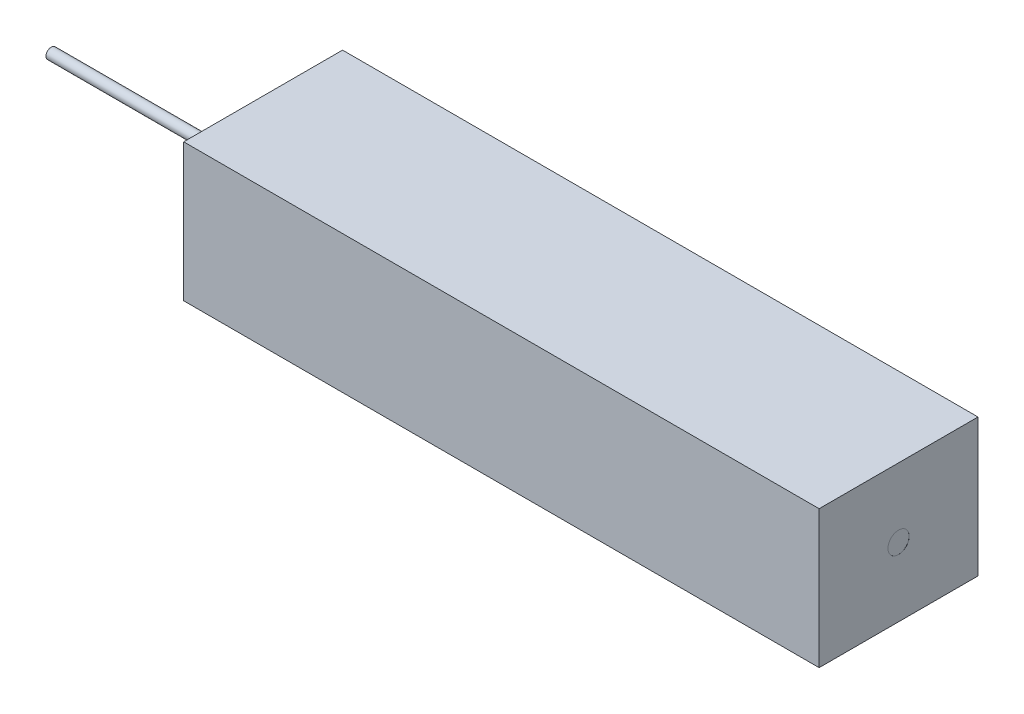
ISO-10303-21;
HEADER;
FILE_DESCRIPTION(('STEP AP214'),'2;1');
FILE_NAME('part.step','',(''),(''),'','','');
FILE_SCHEMA(('AUTOMOTIVE_DESIGN { 1 0 10303 214 1 1 1 1 }'));
ENDSEC;
DATA;
#1=APPLICATION_CONTEXT('core data for automotive mechanical design processes');
#2=APPLICATION_PROTOCOL_DEFINITION('international standard','automotive_design',2000,#1);
#3=PRODUCT_CONTEXT('',#1,'mechanical');
#4=PRODUCT('Part','Part','',(#3));
#5=PRODUCT_RELATED_PRODUCT_CATEGORY('part','',(#4));
#6=PRODUCT_DEFINITION_FORMATION('','',#4);
#7=PRODUCT_DEFINITION_CONTEXT('part definition',#1,'design');
#8=PRODUCT_DEFINITION('design','',#6,#7);
#9=PRODUCT_DEFINITION_SHAPE('','',#8);
#10=(LENGTH_UNIT() NAMED_UNIT(*) SI_UNIT(.MILLI.,.METRE.));
#11=(NAMED_UNIT(*) PLANE_ANGLE_UNIT() SI_UNIT($,.RADIAN.));
#12=(NAMED_UNIT(*) SI_UNIT($,.STERADIAN.) SOLID_ANGLE_UNIT());
#13=UNCERTAINTY_MEASURE_WITH_UNIT(LENGTH_MEASURE(1.E-05),#10,'distance_accuracy_value','');
#14=(GEOMETRIC_REPRESENTATION_CONTEXT(3) GLOBAL_UNCERTAINTY_ASSIGNED_CONTEXT((#13)) GLOBAL_UNIT_ASSIGNED_CONTEXT((#10,
#11,#12)) REPRESENTATION_CONTEXT('',''));
#15=CARTESIAN_POINT('',(0.,0.,0.));
#16=DIRECTION('',(0.,0.,1.));
#17=DIRECTION('',(1.,0.,0.));
#18=AXIS2_PLACEMENT_3D('',#15,#16,#17);
#19=CARTESIAN_POINT('',(600.,65.,-75.));
#20=DIRECTION('',(0.,0.,1.));
#21=DIRECTION('',(0.,-1.,0.));
#22=AXIS2_PLACEMENT_3D('',#19,#20,#21);
#23=PLANE('',#22);
#24=DIRECTION('',(0.,1.,0.));
#25=VECTOR('',#24,1.);
#26=CARTESIAN_POINT('',(0.,65.,-75.));
#27=LINE('',#26,#25);
#28=CARTESIAN_POINT('',(0.,-65.,-75.));
#29=VERTEX_POINT('',#28);
#30=CARTESIAN_POINT('',(0.,65.,-75.));
#31=VERTEX_POINT('',#30);
#32=EDGE_CURVE('E105',#29,#31,#27,.T.);
#33=ORIENTED_EDGE('',*,*,#32,.T.);
#34=DIRECTION('',(-1.,0.,0.));
#35=VECTOR('',#34,1.);
#36=CARTESIAN_POINT('',(600.,65.,-75.));
#37=LINE('',#36,#35);
#38=CARTESIAN_POINT('',(600.,65.,-75.));
#39=VERTEX_POINT('',#38);
#40=EDGE_CURVE('E47',#39,#31,#37,.T.);
#41=ORIENTED_EDGE('',*,*,#40,.F.);
#42=DIRECTION('',(0.,1.,0.));
#43=VECTOR('',#42,1.);
#44=CARTESIAN_POINT('',(600.,65.,-75.));
#45=LINE('',#44,#43);
#46=CARTESIAN_POINT('',(600.,-65.,-75.));
#47=VERTEX_POINT('',#46);
#48=EDGE_CURVE('E91',#47,#39,#45,.T.);
#49=ORIENTED_EDGE('',*,*,#48,.F.);
#50=DIRECTION('',(-1.,0.,0.));
#51=VECTOR('',#50,1.);
#52=CARTESIAN_POINT('',(600.,-65.,-75.));
#53=LINE('',#52,#51);
#54=EDGE_CURVE('E101',#47,#29,#53,.T.);
#55=ORIENTED_EDGE('',*,*,#54,.T.);
#56=EDGE_LOOP('',(#33,#41,#49,#55));
#57=FACE_BOUND('',#56,.T.);
#58=ADVANCED_FACE('F39',(#57),#23,.F.);
#59=CARTESIAN_POINT('',(600.,65.,75.));
#60=DIRECTION('',(0.,-1.,0.));
#61=DIRECTION('',(0.,0.,-1.));
#62=AXIS2_PLACEMENT_3D('',#59,#60,#61);
#63=PLANE('',#62);
#64=DIRECTION('',(0.,0.,1.));
#65=VECTOR('',#64,1.);
#66=CARTESIAN_POINT('',(0.,65.,75.));
#67=LINE('',#66,#65);
#68=CARTESIAN_POINT('',(0.,65.,75.));
#69=VERTEX_POINT('',#68);
#70=EDGE_CURVE('E96',#31,#69,#67,.T.);
#71=ORIENTED_EDGE('',*,*,#70,.T.);
#72=DIRECTION('',(-1.,0.,0.));
#73=VECTOR('',#72,1.);
#74=CARTESIAN_POINT('',(600.,65.,75.));
#75=LINE('',#74,#73);
#76=CARTESIAN_POINT('',(600.,65.,75.));
#77=VERTEX_POINT('',#76);
#78=EDGE_CURVE('E94',#77,#69,#75,.T.);
#79=ORIENTED_EDGE('',*,*,#78,.F.);
#80=DIRECTION('',(0.,0.,1.));
#81=VECTOR('',#80,1.);
#82=CARTESIAN_POINT('',(600.,65.,75.));
#83=LINE('',#82,#81);
#84=EDGE_CURVE('E86',#39,#77,#83,.T.);
#85=ORIENTED_EDGE('',*,*,#84,.F.);
#86=ORIENTED_EDGE('',*,*,#40,.T.);
#87=EDGE_LOOP('',(#71,#79,#85,#86));
#88=FACE_BOUND('',#87,.T.);
#89=ADVANCED_FACE('F95',(#88),#63,.F.);
#90=CARTESIAN_POINT('',(600.,65.,75.));
#91=DIRECTION('',(0.,0.,-1.));
#92=DIRECTION('',(0.,1.,0.));
#93=AXIS2_PLACEMENT_3D('',#90,#91,#92);
#94=PLANE('',#93);
#95=DIRECTION('',(0.,-1.,0.));
#96=VECTOR('',#95,1.);
#97=CARTESIAN_POINT('',(0.,65.,75.));
#98=LINE('',#97,#96);
#99=CARTESIAN_POINT('',(0.,-65.,75.));
#100=VERTEX_POINT('',#99);
#101=EDGE_CURVE('E72',#69,#100,#98,.T.);
#102=ORIENTED_EDGE('',*,*,#101,.T.);
#103=DIRECTION('',(-1.,0.,0.));
#104=VECTOR('',#103,1.);
#105=CARTESIAN_POINT('',(600.,-65.,75.));
#106=LINE('',#105,#104);
#107=CARTESIAN_POINT('',(600.,-65.,75.));
#108=VERTEX_POINT('',#107);
#109=EDGE_CURVE('E97',#108,#100,#106,.T.);
#110=ORIENTED_EDGE('',*,*,#109,.F.);
#111=DIRECTION('',(0.,-1.,0.));
#112=VECTOR('',#111,1.);
#113=CARTESIAN_POINT('',(600.,65.,75.));
#114=LINE('',#113,#112);
#115=EDGE_CURVE('E89',#77,#108,#114,.T.);
#116=ORIENTED_EDGE('',*,*,#115,.F.);
#117=ORIENTED_EDGE('',*,*,#78,.T.);
#118=EDGE_LOOP('',(#102,#110,#116,#117));
#119=FACE_BOUND('',#118,.T.);
#120=ADVANCED_FACE('F99',(#119),#94,.F.);
#121=CARTESIAN_POINT('',(600.,-65.,75.));
#122=DIRECTION('',(0.,1.,0.));
#123=DIRECTION('',(0.,0.,1.));
#124=AXIS2_PLACEMENT_3D('',#121,#122,#123);
#125=PLANE('',#124);
#126=DIRECTION('',(0.,0.,-1.));
#127=VECTOR('',#126,1.);
#128=CARTESIAN_POINT('',(0.,-65.,75.));
#129=LINE('',#128,#127);
#130=EDGE_CURVE('E78',#100,#29,#129,.T.);
#131=ORIENTED_EDGE('',*,*,#130,.T.);
#132=ORIENTED_EDGE('',*,*,#54,.F.);
#133=DIRECTION('',(0.,0.,-1.));
#134=VECTOR('',#133,1.);
#135=CARTESIAN_POINT('',(600.,-65.,75.));
#136=LINE('',#135,#134);
#137=EDGE_CURVE('E55',#108,#47,#136,.T.);
#138=ORIENTED_EDGE('',*,*,#137,.F.);
#139=ORIENTED_EDGE('',*,*,#109,.T.);
#140=EDGE_LOOP('',(#131,#132,#138,#139));
#141=FACE_BOUND('',#140,.T.);
#142=ADVANCED_FACE('F129',(#141),#125,.F.);
#143=CARTESIAN_POINT('',(600.,0.,0.));
#144=DIRECTION('',(1.,0.,0.));
#145=DIRECTION('',(0.,0.,-1.));
#146=AXIS2_PLACEMENT_3D('',#143,#144,#145);
#147=PLANE('',#146);
#148=CARTESIAN_POINT('',(600.,0.,0.));
#149=DIRECTION('',(1.,0.,0.));
#150=DIRECTION('',(0.,0.,-1.));
#151=AXIS2_PLACEMENT_3D('',#148,#149,#150);
#152=CIRCLE('',#151,10.);
#153=CARTESIAN_POINT('',(600.,0.,-10.));
#154=VERTEX_POINT('',#153);
#155=EDGE_CURVE('E234',#154,#154,#152,.T.);
#156=ORIENTED_EDGE('',*,*,#155,.F.);
#157=EDGE_LOOP('',(#156));
#158=FACE_BOUND('',#157,.T.);
#159=ORIENTED_EDGE('',*,*,#48,.T.);
#160=ORIENTED_EDGE('',*,*,#84,.T.);
#161=ORIENTED_EDGE('',*,*,#115,.T.);
#162=ORIENTED_EDGE('',*,*,#137,.T.);
#163=EDGE_LOOP('',(#159,#160,#161,#162));
#164=FACE_BOUND('',#163,.T.);
#165=ADVANCED_FACE('F87',(#158,#164),#147,.T.);
#166=CARTESIAN_POINT('',(0.,0.,0.));
#167=DIRECTION('',(1.,0.,0.));
#168=DIRECTION('',(0.,0.,-1.));
#169=AXIS2_PLACEMENT_3D('',#166,#167,#168);
#170=PLANE('',#169);
#171=CARTESIAN_POINT('',(0.,0.,0.));
#172=DIRECTION('',(1.,0.,0.));
#173=DIRECTION('',(0.,0.,-1.));
#174=AXIS2_PLACEMENT_3D('',#171,#172,#173);
#175=CIRCLE('',#174,5.);
#176=CARTESIAN_POINT('',(0.,0.,-5.));
#177=VERTEX_POINT('',#176);
#178=EDGE_CURVE('E11',#177,#177,#175,.F.);
#179=ORIENTED_EDGE('',*,*,#178,.F.);
#180=EDGE_LOOP('',(#179));
#181=FACE_BOUND('',#180,.T.);
#182=ORIENTED_EDGE('',*,*,#32,.F.);
#183=ORIENTED_EDGE('',*,*,#130,.F.);
#184=ORIENTED_EDGE('',*,*,#101,.F.);
#185=ORIENTED_EDGE('',*,*,#70,.F.);
#186=EDGE_LOOP('',(#182,#183,#184,#185));
#187=FACE_BOUND('',#186,.T.);
#188=ADVANCED_FACE('F116',(#181,#187),#170,.F.);
#189=CARTESIAN_POINT('',(-200.,0.,0.));
#190=DIRECTION('',(1.,0.,0.));
#191=DIRECTION('',(0.,0.,-1.));
#192=AXIS2_PLACEMENT_3D('',#189,#190,#191);
#193=CYLINDRICAL_SURFACE('',#192,5.);
#194=CARTESIAN_POINT('',(-200.,0.,0.));
#195=DIRECTION('',(-1.,0.,0.));
#196=DIRECTION('',(0.,0.,1.));
#197=AXIS2_PLACEMENT_3D('',#194,#195,#196);
#198=CIRCLE('',#197,5.);
#199=CARTESIAN_POINT('',(-200.,0.,5.));
#200=VERTEX_POINT('',#199);
#201=EDGE_CURVE('E108',#200,#200,#198,.T.);
#202=ORIENTED_EDGE('',*,*,#201,.F.);
#203=EDGE_LOOP('',(#202));
#204=FACE_BOUND('',#203,.T.);
#205=ORIENTED_EDGE('',*,*,#178,.T.);
#206=EDGE_LOOP('',(#205));
#207=FACE_BOUND('',#206,.T.);
#208=ADVANCED_FACE('F118',(#204,#207),#193,.T.);
#209=CARTESIAN_POINT('',(-200.,0.,0.));
#210=DIRECTION('',(-1.,0.,0.));
#211=DIRECTION('',(0.,0.,1.));
#212=AXIS2_PLACEMENT_3D('',#209,#210,#211);
#213=PLANE('',#212);
#214=ORIENTED_EDGE('',*,*,#201,.T.);
#215=EDGE_LOOP('',(#214));
#216=FACE_BOUND('',#215,.T.);
#217=ADVANCED_FACE('F125',(#216),#213,.T.);
#218=CARTESIAN_POINT('',(599.9,0.,0.));
#219=DIRECTION('',(1.,0.,0.));
#220=DIRECTION('',(0.,0.,-1.));
#221=AXIS2_PLACEMENT_3D('',#218,#219,#220);
#222=CYLINDRICAL_SURFACE('',#221,10.);
#223=CARTESIAN_POINT('',(599.9,0.,0.));
#224=DIRECTION('',(1.,0.,0.));
#225=DIRECTION('',(0.,0.,-1.));
#226=AXIS2_PLACEMENT_3D('',#223,#224,#225);
#227=CIRCLE('',#226,10.);
#228=CARTESIAN_POINT('',(599.9,0.,-10.));
#229=VERTEX_POINT('',#228);
#230=EDGE_CURVE('E231',#229,#229,#227,.T.);
#231=ORIENTED_EDGE('',*,*,#230,.F.);
#232=EDGE_LOOP('',(#231));
#233=FACE_BOUND('',#232,.T.);
#234=ORIENTED_EDGE('',*,*,#155,.T.);
#235=EDGE_LOOP('',(#234));
#236=FACE_BOUND('',#235,.T.);
#237=ADVANCED_FACE('F162',(#233,#236),#222,.F.);
#238=CARTESIAN_POINT('',(599.9,0.,0.));
#239=DIRECTION('',(1.,0.,0.));
#240=DIRECTION('',(0.,0.,-1.));
#241=AXIS2_PLACEMENT_3D('',#238,#239,#240);
#242=PLANE('',#241);
#243=ORIENTED_EDGE('',*,*,#230,.T.);
#244=EDGE_LOOP('',(#243));
#245=FACE_BOUND('',#244,.T.);
#246=ADVANCED_FACE('F167',(#245),#242,.T.);
#247=CLOSED_SHELL('',(#58,#89,#120,#142,#165,#188,#208,#217,#237,#246));
#248=MANIFOLD_SOLID_BREP('B2',#247);
#249=ADVANCED_BREP_SHAPE_REPRESENTATION('',(#18,#248),#14);
#250=SHAPE_DEFINITION_REPRESENTATION(#9,#249);
ENDSEC;
END-ISO-10303-21;
